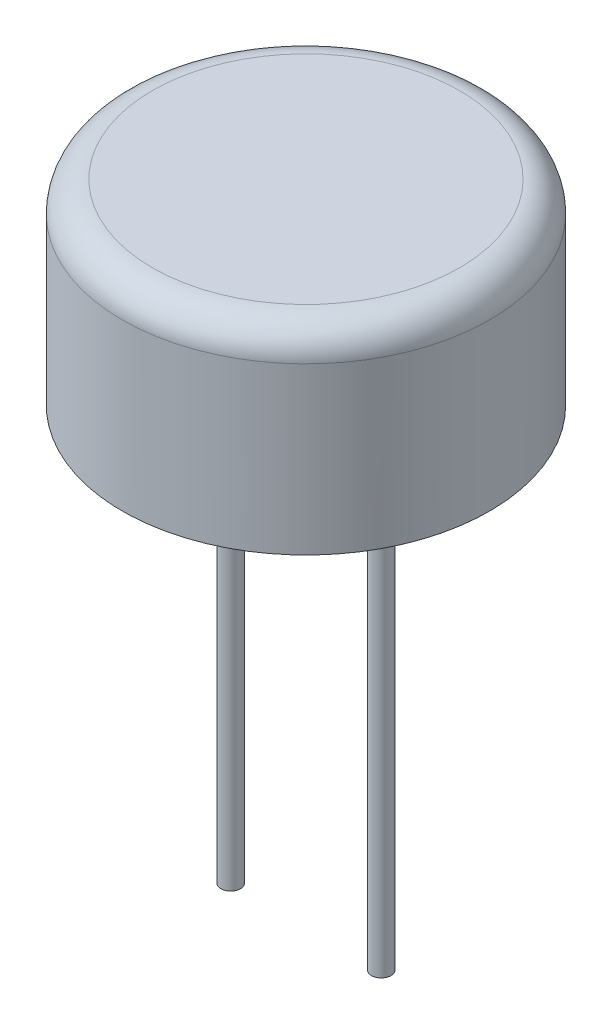
ISO-10303-21;
HEADER;
FILE_DESCRIPTION(('STEP AP214'),'2;1');
FILE_NAME('part.step','',(''),(''),'','','');
FILE_SCHEMA(('AUTOMOTIVE_DESIGN { 1 0 10303 214 1 1 1 1 }'));
ENDSEC;
DATA;
#1=APPLICATION_CONTEXT('core data for automotive mechanical design processes');
#2=APPLICATION_PROTOCOL_DEFINITION('international standard','automotive_design',2000,#1);
#3=PRODUCT_CONTEXT('',#1,'mechanical');
#4=PRODUCT('Part','Part','',(#3));
#5=PRODUCT_RELATED_PRODUCT_CATEGORY('part','',(#4));
#6=PRODUCT_DEFINITION_FORMATION('','',#4);
#7=PRODUCT_DEFINITION_CONTEXT('part definition',#1,'design');
#8=PRODUCT_DEFINITION('design','',#6,#7);
#9=PRODUCT_DEFINITION_SHAPE('','',#8);
#10=(LENGTH_UNIT() NAMED_UNIT(*) SI_UNIT(.MILLI.,.METRE.));
#11=(NAMED_UNIT(*) PLANE_ANGLE_UNIT() SI_UNIT($,.RADIAN.));
#12=(NAMED_UNIT(*) SI_UNIT($,.STERADIAN.) SOLID_ANGLE_UNIT());
#13=UNCERTAINTY_MEASURE_WITH_UNIT(LENGTH_MEASURE(1.E-05),#10,'distance_accuracy_value','');
#14=(GEOMETRIC_REPRESENTATION_CONTEXT(3) GLOBAL_UNCERTAINTY_ASSIGNED_CONTEXT((#13)) GLOBAL_UNIT_ASSIGNED_CONTEXT((#10,
#11,#12)) REPRESENTATION_CONTEXT('',''));
#15=CARTESIAN_POINT('',(0.,0.,0.));
#16=DIRECTION('',(0.,0.,1.));
#17=DIRECTION('',(1.,0.,0.));
#18=AXIS2_PLACEMENT_3D('',#15,#16,#17);
#19=CARTESIAN_POINT('',(0.,6.5,0.));
#20=DIRECTION('',(0.,-1.,0.));
#21=DIRECTION('',(0.,0.,-1.));
#22=AXIS2_PLACEMENT_3D('',#19,#20,#21);
#23=CYLINDRICAL_SURFACE('',#22,6.1);
#24=CARTESIAN_POINT('',(0.,5.5,0.));
#25=DIRECTION('',(0.,1.,0.));
#26=DIRECTION('',(0.,0.,1.));
#27=AXIS2_PLACEMENT_3D('',#24,#25,#26);
#28=CIRCLE('',#27,6.1);
#29=CARTESIAN_POINT('',(0.,5.5,-6.1));
#30=VERTEX_POINT('',#29);
#31=EDGE_CURVE('E10',#30,#30,#28,.F.);
#32=CARTESIAN_POINT('',(0.,0.,0.));
#33=DIRECTION('',(0.,1.,0.));
#34=DIRECTION('',(0.,0.,1.));
#35=AXIS2_PLACEMENT_3D('',#32,#33,#34);
#36=CIRCLE('',#35,6.1);
#37=CARTESIAN_POINT('',(0.,0.,-6.1));
#38=VERTEX_POINT('',#37);
#39=EDGE_CURVE('E53',#38,#38,#36,.T.);
#40=CARTESIAN_POINT('',(0.,5.5,-6.1));
#41=CARTESIAN_POINT('',(0.,5.44270833333333,-6.1));
#42=CARTESIAN_POINT('',(0.,5.38541666666667,-6.1));
#43=CARTESIAN_POINT('',(0.,5.27083333333333,-6.1));
#44=CARTESIAN_POINT('',(0.,5.21354166666667,-6.1));
#45=CARTESIAN_POINT('',(0.,5.09895833333333,-6.1));
#46=CARTESIAN_POINT('',(0.,5.04166666666667,-6.1));
#47=CARTESIAN_POINT('',(0.,4.92708333333333,-6.1));
#48=CARTESIAN_POINT('',(0.,4.86979166666667,-6.1));
#49=CARTESIAN_POINT('',(0.,4.75520833333333,-6.1));
#50=CARTESIAN_POINT('',(0.,4.69791666666667,-6.1));
#51=CARTESIAN_POINT('',(0.,4.58333333333333,-6.1));
#52=CARTESIAN_POINT('',(0.,4.52604166666667,-6.1));
#53=CARTESIAN_POINT('',(0.,4.41145833333333,-6.1));
#54=CARTESIAN_POINT('',(0.,4.35416666666667,-6.1));
#55=CARTESIAN_POINT('',(0.,4.23958333333333,-6.1));
#56=CARTESIAN_POINT('',(0.,4.18229166666667,-6.1));
#57=CARTESIAN_POINT('',(0.,4.06770833333333,-6.1));
#58=CARTESIAN_POINT('',(0.,4.01041666666667,-6.1));
#59=CARTESIAN_POINT('',(0.,3.89583333333333,-6.1));
#60=CARTESIAN_POINT('',(0.,3.83854166666667,-6.1));
#61=CARTESIAN_POINT('',(0.,3.72395833333333,-6.1));
#62=CARTESIAN_POINT('',(0.,3.66666666666667,-6.1));
#63=CARTESIAN_POINT('',(0.,3.55208333333333,-6.1));
#64=CARTESIAN_POINT('',(0.,3.49479166666667,-6.1));
#65=CARTESIAN_POINT('',(0.,3.38020833333333,-6.1));
#66=CARTESIAN_POINT('',(0.,3.32291666666667,-6.1));
#67=CARTESIAN_POINT('',(0.,3.20833333333333,-6.1));
#68=CARTESIAN_POINT('',(0.,3.15104166666667,-6.1));
#69=CARTESIAN_POINT('',(0.,3.03645833333333,-6.1));
#70=CARTESIAN_POINT('',(0.,2.97916666666667,-6.1));
#71=CARTESIAN_POINT('',(0.,2.86458333333333,-6.1));
#72=CARTESIAN_POINT('',(0.,2.80729166666667,-6.1));
#73=CARTESIAN_POINT('',(0.,2.69270833333333,-6.1));
#74=CARTESIAN_POINT('',(0.,2.63541666666667,-6.1));
#75=CARTESIAN_POINT('',(0.,2.52083333333333,-6.1));
#76=CARTESIAN_POINT('',(0.,2.46354166666667,-6.1));
#77=CARTESIAN_POINT('',(0.,2.34895833333333,-6.1));
#78=CARTESIAN_POINT('',(0.,2.29166666666667,-6.1));
#79=CARTESIAN_POINT('',(0.,2.17708333333333,-6.1));
#80=CARTESIAN_POINT('',(0.,2.11979166666667,-6.1));
#81=CARTESIAN_POINT('',(0.,2.00520833333333,-6.1));
#82=CARTESIAN_POINT('',(0.,1.94791666666667,-6.1));
#83=CARTESIAN_POINT('',(0.,1.83333333333333,-6.1));
#84=CARTESIAN_POINT('',(0.,1.77604166666667,-6.1));
#85=CARTESIAN_POINT('',(0.,1.66145833333333,-6.1));
#86=CARTESIAN_POINT('',(0.,1.60416666666667,-6.1));
#87=CARTESIAN_POINT('',(0.,1.48958333333333,-6.1));
#88=CARTESIAN_POINT('',(0.,1.43229166666667,-6.1));
#89=CARTESIAN_POINT('',(0.,1.31770833333333,-6.1));
#90=CARTESIAN_POINT('',(0.,1.26041666666667,-6.1));
#91=CARTESIAN_POINT('',(0.,1.14583333333333,-6.1));
#92=CARTESIAN_POINT('',(0.,1.08854166666667,-6.1));
#93=CARTESIAN_POINT('',(0.,0.973958333333333,-6.1));
#94=CARTESIAN_POINT('',(0.,0.916666666666667,-6.1));
#95=CARTESIAN_POINT('',(0.,0.802083333333333,-6.1));
#96=CARTESIAN_POINT('',(0.,0.744791666666667,-6.1));
#97=CARTESIAN_POINT('',(0.,0.630208333333333,-6.1));
#98=CARTESIAN_POINT('',(0.,0.572916666666666,-6.1));
#99=CARTESIAN_POINT('',(0.,0.458333333333333,-6.1));
#100=CARTESIAN_POINT('',(0.,0.401041666666667,-6.1));
#101=CARTESIAN_POINT('',(0.,0.286458333333334,-6.1));
#102=CARTESIAN_POINT('',(0.,0.229166666666667,-6.1));
#103=CARTESIAN_POINT('',(0.,0.114583333333333,-6.1));
#104=CARTESIAN_POINT('',(0.,0.0572916666666668,-6.1));
#105=CARTESIAN_POINT('',(0.,0.,-6.1));
#106=B_SPLINE_CURVE_WITH_KNOTS('',3,(#40,#41,#42,#43,#44,#45,#46,#47,#48,#49,#50,#51,#52,#53,
#54,#55,#56,#57,#58,#59,#60,#61,#62,#63,#64,#65,#66,#67,#68,#69,#70,#71,#72,#73,#74,#75,#76,#77,
#78,#79,#80,#81,#82,#83,#84,#85,#86,#87,#88,#89,#90,#91,#92,#93,#94,#95,#96,#97,#98,#99,#100,
#101,#102,#103,#104,#105),.UNSPECIFIED.,.F.,.F.,(4,2,2,2,2,2,2,2,2,2,2,2,2,2,2,2,2,2,2,2,2,2,2,
2,2,2,2,2,2,2,2,2,4),(0.,0.171874999999999,0.343749999999999,0.515625,0.6875,0.859375,1.03125,
1.203125,1.375,1.546875,1.71875,1.890625,2.0625,2.234375,2.40625,2.578125,2.75,2.921875,3.09375,
3.265625,3.4375,3.609375,3.78125,3.953125,4.125,4.296875,4.46875,4.640625,4.8125,4.984375,
5.15625,5.328125,5.5),.UNSPECIFIED.);
#107=EDGE_CURVE('BSEAM33',#30,#38,#106,.T.);
#108=ORIENTED_EDGE('',*,*,#31,.T.);
#109=ORIENTED_EDGE('',*,*,#39,.T.);
#110=ORIENTED_EDGE('',*,*,#107,.T.);
#111=ORIENTED_EDGE('',*,*,#107,.F.);
#112=EDGE_LOOP('',(#108,#110,#109,#111));
#113=FACE_BOUND('',#112,.T.);
#114=ADVANCED_FACE('F33',(#113),#23,.T.);
#115=CARTESIAN_POINT('',(0.,6.5,0.));
#116=DIRECTION('',(0.,1.,0.));
#117=DIRECTION('',(0.,0.,1.));
#118=AXIS2_PLACEMENT_3D('',#115,#116,#117);
#119=PLANE('',#118);
#120=CARTESIAN_POINT('',(0.,6.5,0.));
#121=DIRECTION('',(0.,1.,0.));
#122=DIRECTION('',(0.,0.,1.));
#123=AXIS2_PLACEMENT_3D('',#120,#121,#122);
#124=CIRCLE('',#123,5.1);
#125=CARTESIAN_POINT('',(0.,6.5,5.1));
#126=VERTEX_POINT('',#125);
#127=EDGE_CURVE('E40',#126,#126,#124,.T.);
#128=ORIENTED_EDGE('',*,*,#127,.T.);
#129=EDGE_LOOP('',(#128));
#130=FACE_BOUND('',#129,.T.);
#131=ADVANCED_FACE('F76',(#130),#119,.T.);
#132=CARTESIAN_POINT('',(0.,0.,0.));
#133=DIRECTION('',(0.,1.,0.));
#134=DIRECTION('',(0.,0.,1.));
#135=AXIS2_PLACEMENT_3D('',#132,#133,#134);
#136=PLANE('',#135);
#137=CARTESIAN_POINT('',(2.5,0.,0.));
#138=DIRECTION('',(0.,1.,0.));
#139=DIRECTION('',(0.,0.,1.));
#140=AXIS2_PLACEMENT_3D('',#137,#138,#139);
#141=CIRCLE('',#140,0.325);
#142=CARTESIAN_POINT('',(2.5,0.,0.325));
#143=VERTEX_POINT('',#142);
#144=EDGE_CURVE('E44',#143,#143,#141,.F.);
#145=ORIENTED_EDGE('',*,*,#144,.F.);
#146=EDGE_LOOP('',(#145));
#147=FACE_BOUND('',#146,.T.);
#148=CARTESIAN_POINT('',(-2.5,0.,0.));
#149=DIRECTION('',(0.,1.,0.));
#150=DIRECTION('',(0.,0.,1.));
#151=AXIS2_PLACEMENT_3D('',#148,#149,#150);
#152=CIRCLE('',#151,0.325);
#153=CARTESIAN_POINT('',(-2.5,0.,0.325));
#154=VERTEX_POINT('',#153);
#155=EDGE_CURVE('E48',#154,#154,#152,.F.);
#156=ORIENTED_EDGE('',*,*,#155,.F.);
#157=EDGE_LOOP('',(#156));
#158=FACE_BOUND('',#157,.T.);
#159=ORIENTED_EDGE('',*,*,#39,.F.);
#160=EDGE_LOOP('',(#159));
#161=FACE_BOUND('',#160,.T.);
#162=ADVANCED_FACE('F72',(#147,#158,#161),#136,.F.);
#163=CARTESIAN_POINT('',(-2.5,-15.,0.));
#164=DIRECTION('',(0.,1.,0.));
#165=DIRECTION('',(0.,0.,1.));
#166=AXIS2_PLACEMENT_3D('',#163,#164,#165);
#167=CYLINDRICAL_SURFACE('',#166,0.325);
#168=CARTESIAN_POINT('',(-2.5,-15.,0.));
#169=DIRECTION('',(0.,-1.,0.));
#170=DIRECTION('',(0.,0.,-1.));
#171=AXIS2_PLACEMENT_3D('',#168,#169,#170);
#172=CIRCLE('',#171,0.325);
#173=CARTESIAN_POINT('',(-2.5,-15.,-0.325));
#174=VERTEX_POINT('',#173);
#175=EDGE_CURVE('E56',#174,#174,#172,.T.);
#176=ORIENTED_EDGE('',*,*,#175,.F.);
#177=EDGE_LOOP('',(#176));
#178=FACE_BOUND('',#177,.T.);
#179=ORIENTED_EDGE('',*,*,#155,.T.);
#180=EDGE_LOOP('',(#179));
#181=FACE_BOUND('',#180,.T.);
#182=ADVANCED_FACE('F75',(#178,#181),#167,.T.);
#183=CARTESIAN_POINT('',(-2.5,-15.,0.));
#184=DIRECTION('',(0.,-1.,0.));
#185=DIRECTION('',(0.,0.,-1.));
#186=AXIS2_PLACEMENT_3D('',#183,#184,#185);
#187=PLANE('',#186);
#188=ORIENTED_EDGE('',*,*,#175,.T.);
#189=EDGE_LOOP('',(#188));
#190=FACE_BOUND('',#189,.T.);
#191=ADVANCED_FACE('F68',(#190),#187,.T.);
#192=CARTESIAN_POINT('',(2.5,-15.,0.));
#193=DIRECTION('',(0.,1.,0.));
#194=DIRECTION('',(0.,0.,1.));
#195=AXIS2_PLACEMENT_3D('',#192,#193,#194);
#196=CYLINDRICAL_SURFACE('',#195,0.325);
#197=CARTESIAN_POINT('',(2.5,-15.,0.));
#198=DIRECTION('',(0.,-1.,0.));
#199=DIRECTION('',(0.,0.,-1.));
#200=AXIS2_PLACEMENT_3D('',#197,#198,#199);
#201=CIRCLE('',#200,0.325);
#202=CARTESIAN_POINT('',(2.5,-15.,-0.325));
#203=VERTEX_POINT('',#202);
#204=EDGE_CURVE('E59',#203,#203,#201,.T.);
#205=ORIENTED_EDGE('',*,*,#204,.F.);
#206=EDGE_LOOP('',(#205));
#207=FACE_BOUND('',#206,.T.);
#208=ORIENTED_EDGE('',*,*,#144,.T.);
#209=EDGE_LOOP('',(#208));
#210=FACE_BOUND('',#209,.T.);
#211=ADVANCED_FACE('F65',(#207,#210),#196,.T.);
#212=CARTESIAN_POINT('',(2.5,-15.,0.));
#213=DIRECTION('',(0.,-1.,0.));
#214=DIRECTION('',(0.,0.,-1.));
#215=AXIS2_PLACEMENT_3D('',#212,#213,#214);
#216=PLANE('',#215);
#217=ORIENTED_EDGE('',*,*,#204,.T.);
#218=EDGE_LOOP('',(#217));
#219=FACE_BOUND('',#218,.T.);
#220=ADVANCED_FACE('F63',(#219),#216,.T.);
#221=CARTESIAN_POINT('',(0.,5.5,0.));
#222=DIRECTION('',(0.,1.,0.));
#223=DIRECTION('',(0.,0.,1.));
#224=AXIS2_PLACEMENT_3D('',#221,#222,#223);
#225=TOROIDAL_SURFACE('',#224,5.1,1.);
#226=ORIENTED_EDGE('',*,*,#31,.F.);
#227=EDGE_LOOP('',(#226));
#228=FACE_BOUND('',#227,.T.);
#229=ORIENTED_EDGE('',*,*,#127,.F.);
#230=EDGE_LOOP('',(#229));
#231=FACE_BOUND('',#230,.T.);
#232=ADVANCED_FACE('F35',(#228,#231),#225,.T.);
#233=CLOSED_SHELL('',(#114,#131,#162,#182,#191,#211,#220,#232));
#234=MANIFOLD_SOLID_BREP('B2',#233);
#235=ADVANCED_BREP_SHAPE_REPRESENTATION('',(#18,#234),#14);
#236=SHAPE_DEFINITION_REPRESENTATION(#9,#235);
ENDSEC;
END-ISO-10303-21;
